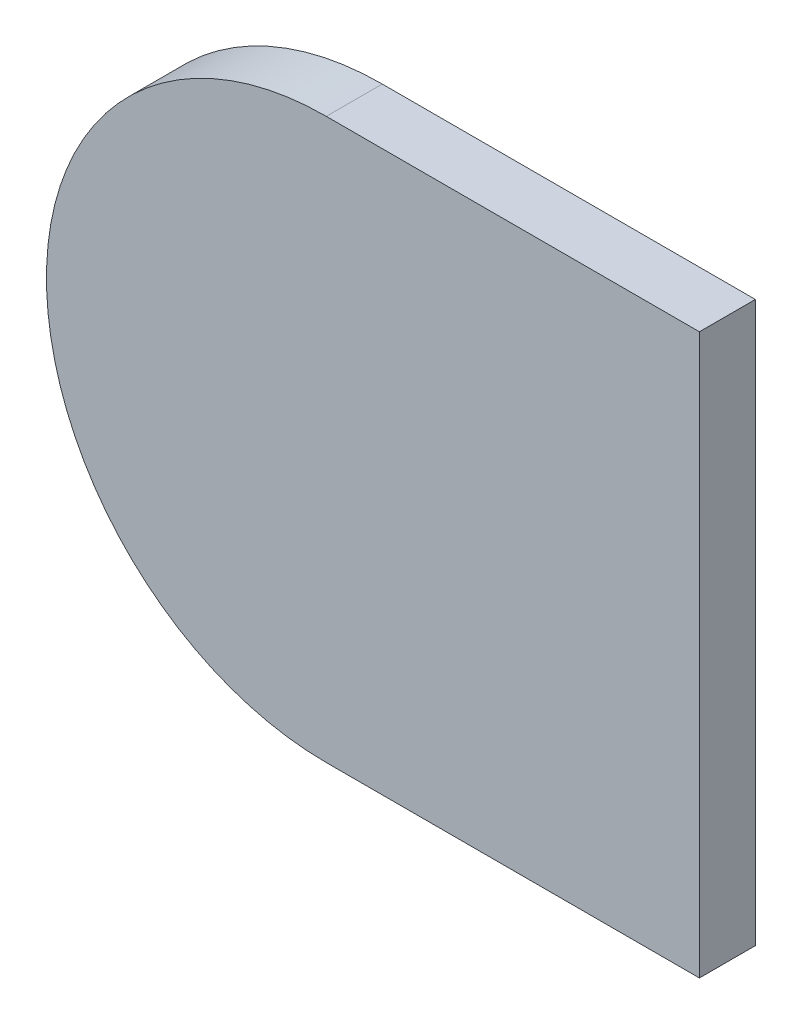
ISO-10303-21;
HEADER;
FILE_DESCRIPTION(('STEP AP214'),'2;1');
FILE_NAME('part.step','',(''),(''),'','','');
FILE_SCHEMA(('AUTOMOTIVE_DESIGN { 1 0 10303 214 1 1 1 1 }'));
ENDSEC;
DATA;
#1=APPLICATION_CONTEXT('core data for automotive mechanical design processes');
#2=APPLICATION_PROTOCOL_DEFINITION('international standard','automotive_design',2000,#1);
#3=PRODUCT_CONTEXT('',#1,'mechanical');
#4=PRODUCT('Part','Part','',(#3));
#5=PRODUCT_RELATED_PRODUCT_CATEGORY('part','',(#4));
#6=PRODUCT_DEFINITION_FORMATION('','',#4);
#7=PRODUCT_DEFINITION_CONTEXT('part definition',#1,'design');
#8=PRODUCT_DEFINITION('design','',#6,#7);
#9=PRODUCT_DEFINITION_SHAPE('','',#8);
#10=(LENGTH_UNIT() NAMED_UNIT(*) SI_UNIT(.MILLI.,.METRE.));
#11=(NAMED_UNIT(*) PLANE_ANGLE_UNIT() SI_UNIT($,.RADIAN.));
#12=(NAMED_UNIT(*) SI_UNIT($,.STERADIAN.) SOLID_ANGLE_UNIT());
#13=UNCERTAINTY_MEASURE_WITH_UNIT(LENGTH_MEASURE(1.E-05),#10,'distance_accuracy_value','');
#14=(GEOMETRIC_REPRESENTATION_CONTEXT(3) GLOBAL_UNCERTAINTY_ASSIGNED_CONTEXT((#13)) GLOBAL_UNIT_ASSIGNED_CONTEXT((#10,
#11,#12)) REPRESENTATION_CONTEXT('',''));
#15=CARTESIAN_POINT('',(0.,0.,0.));
#16=DIRECTION('',(0.,0.,1.));
#17=DIRECTION('',(1.,0.,0.));
#18=AXIS2_PLACEMENT_3D('',#15,#16,#17);
#19=CARTESIAN_POINT('',(40.,0.,6.));
#20=DIRECTION('',(1.,0.,0.));
#21=DIRECTION('',(0.,0.,-1.));
#22=AXIS2_PLACEMENT_3D('',#19,#20,#21);
#23=PLANE('',#22);
#24=DIRECTION('',(0.,-1.,0.));
#25=VECTOR('',#24,1.);
#26=CARTESIAN_POINT('',(40.,0.,0.));
#27=LINE('',#26,#25);
#28=CARTESIAN_POINT('',(40.,30.,0.));
#29=VERTEX_POINT('',#28);
#30=CARTESIAN_POINT('',(40.,-30.,0.));
#31=VERTEX_POINT('',#30);
#32=EDGE_CURVE('E107',#29,#31,#27,.T.);
#33=ORIENTED_EDGE('',*,*,#32,.F.);
#34=DIRECTION('',(0.,0.,-1.));
#35=VECTOR('',#34,1.);
#36=CARTESIAN_POINT('',(40.,30.,6.));
#37=LINE('',#36,#35);
#38=CARTESIAN_POINT('',(40.,30.,6.));
#39=VERTEX_POINT('',#38);
#40=EDGE_CURVE('E11',#39,#29,#37,.T.);
#41=ORIENTED_EDGE('',*,*,#40,.F.);
#42=DIRECTION('',(0.,-1.,0.));
#43=VECTOR('',#42,1.);
#44=CARTESIAN_POINT('',(40.,0.,6.));
#45=LINE('',#44,#43);
#46=CARTESIAN_POINT('',(40.,-30.,6.));
#47=VERTEX_POINT('',#46);
#48=EDGE_CURVE('E100',#39,#47,#45,.T.);
#49=ORIENTED_EDGE('',*,*,#48,.T.);
#50=DIRECTION('',(0.,0.,-1.));
#51=VECTOR('',#50,1.);
#52=CARTESIAN_POINT('',(40.,-30.,6.));
#53=LINE('',#52,#51);
#54=EDGE_CURVE('E81',#47,#31,#53,.T.);
#55=ORIENTED_EDGE('',*,*,#54,.T.);
#56=EDGE_LOOP('',(#33,#41,#49,#55));
#57=FACE_BOUND('',#56,.T.);
#58=ADVANCED_FACE('F43',(#57),#23,.T.);
#59=CARTESIAN_POINT('',(0.,30.,6.));
#60=DIRECTION('',(0.,1.,0.));
#61=DIRECTION('',(0.,0.,1.));
#62=AXIS2_PLACEMENT_3D('',#59,#60,#61);
#63=PLANE('',#62);
#64=DIRECTION('',(1.,0.,0.));
#65=VECTOR('',#64,1.);
#66=CARTESIAN_POINT('',(0.,30.,0.));
#67=LINE('',#66,#65);
#68=CARTESIAN_POINT('',(0.,30.,0.));
#69=VERTEX_POINT('',#68);
#70=EDGE_CURVE('E94',#69,#29,#67,.T.);
#71=ORIENTED_EDGE('',*,*,#70,.F.);
#72=DIRECTION('',(0.,0.,-1.));
#73=VECTOR('',#72,1.);
#74=CARTESIAN_POINT('',(0.,30.,6.));
#75=LINE('',#74,#73);
#76=CARTESIAN_POINT('',(0.,30.,6.));
#77=VERTEX_POINT('',#76);
#78=EDGE_CURVE('E51',#77,#69,#75,.T.);
#79=ORIENTED_EDGE('',*,*,#78,.F.);
#80=DIRECTION('',(1.,0.,0.));
#81=VECTOR('',#80,1.);
#82=CARTESIAN_POINT('',(0.,30.,6.));
#83=LINE('',#82,#81);
#84=EDGE_CURVE('E92',#77,#39,#83,.T.);
#85=ORIENTED_EDGE('',*,*,#84,.T.);
#86=ORIENTED_EDGE('',*,*,#40,.T.);
#87=EDGE_LOOP('',(#71,#79,#85,#86));
#88=FACE_BOUND('',#87,.T.);
#89=ADVANCED_FACE('F90',(#88),#63,.T.);
#90=CARTESIAN_POINT('',(0.,0.,6.));
#91=DIRECTION('',(0.,0.,-1.));
#92=DIRECTION('',(-1.,0.,0.));
#93=AXIS2_PLACEMENT_3D('',#90,#91,#92);
#94=CYLINDRICAL_SURFACE('',#93,30.);
#95=CARTESIAN_POINT('',(0.,0.,0.));
#96=DIRECTION('',(0.,0.,1.));
#97=DIRECTION('',(1.,0.,0.));
#98=AXIS2_PLACEMENT_3D('',#95,#96,#97);
#99=CIRCLE('',#98,30.);
#100=CARTESIAN_POINT('',(0.,-30.,0.));
#101=VERTEX_POINT('',#100);
#102=EDGE_CURVE('E74',#69,#101,#99,.T.);
#103=ORIENTED_EDGE('',*,*,#102,.T.);
#104=DIRECTION('',(0.,0.,-1.));
#105=VECTOR('',#104,1.);
#106=CARTESIAN_POINT('',(0.,-30.,6.));
#107=LINE('',#106,#105);
#108=CARTESIAN_POINT('',(0.,-30.,6.));
#109=VERTEX_POINT('',#108);
#110=EDGE_CURVE('E95',#109,#101,#107,.T.);
#111=ORIENTED_EDGE('',*,*,#110,.F.);
#112=CARTESIAN_POINT('',(0.,0.,6.));
#113=DIRECTION('',(0.,0.,1.));
#114=DIRECTION('',(1.,0.,0.));
#115=AXIS2_PLACEMENT_3D('',#112,#113,#114);
#116=CIRCLE('',#115,30.);
#117=EDGE_CURVE('E96',#77,#109,#116,.T.);
#118=ORIENTED_EDGE('',*,*,#117,.F.);
#119=ORIENTED_EDGE('',*,*,#78,.T.);
#120=EDGE_LOOP('',(#103,#111,#118,#119));
#121=FACE_BOUND('',#120,.T.);
#122=ADVANCED_FACE('F97',(#121),#94,.T.);
#123=CARTESIAN_POINT('',(0.,-30.,6.));
#124=DIRECTION('',(0.,1.,0.));
#125=DIRECTION('',(0.,0.,1.));
#126=AXIS2_PLACEMENT_3D('',#123,#124,#125);
#127=PLANE('',#126);
#128=DIRECTION('',(1.,0.,0.));
#129=VECTOR('',#128,1.);
#130=CARTESIAN_POINT('',(0.,-30.,0.));
#131=LINE('',#130,#129);
#132=EDGE_CURVE('E102',#101,#31,#131,.T.);
#133=ORIENTED_EDGE('',*,*,#132,.T.);
#134=ORIENTED_EDGE('',*,*,#54,.F.);
#135=DIRECTION('',(1.,0.,0.));
#136=VECTOR('',#135,1.);
#137=CARTESIAN_POINT('',(0.,-30.,6.));
#138=LINE('',#137,#136);
#139=EDGE_CURVE('E59',#109,#47,#138,.T.);
#140=ORIENTED_EDGE('',*,*,#139,.F.);
#141=ORIENTED_EDGE('',*,*,#110,.T.);
#142=EDGE_LOOP('',(#133,#134,#140,#141));
#143=FACE_BOUND('',#142,.T.);
#144=ADVANCED_FACE('F117',(#143),#127,.F.);
#145=CARTESIAN_POINT('',(0.,0.,6.));
#146=DIRECTION('',(0.,0.,1.));
#147=DIRECTION('',(1.,0.,0.));
#148=AXIS2_PLACEMENT_3D('',#145,#146,#147);
#149=PLANE('',#148);
#150=ORIENTED_EDGE('',*,*,#48,.F.);
#151=ORIENTED_EDGE('',*,*,#84,.F.);
#152=ORIENTED_EDGE('',*,*,#117,.T.);
#153=ORIENTED_EDGE('',*,*,#139,.T.);
#154=EDGE_LOOP('',(#150,#151,#152,#153));
#155=FACE_BOUND('',#154,.T.);
#156=ADVANCED_FACE('F99',(#155),#149,.T.);
#157=CARTESIAN_POINT('',(0.,0.,0.));
#158=DIRECTION('',(0.,0.,1.));
#159=DIRECTION('',(1.,0.,0.));
#160=AXIS2_PLACEMENT_3D('',#157,#158,#159);
#161=PLANE('',#160);
#162=CARTESIAN_POINT('',(0.,0.,0.));
#163=DIRECTION('',(0.,0.,-1.));
#164=DIRECTION('',(-1.,0.,0.));
#165=AXIS2_PLACEMENT_3D('',#162,#163,#164);
#166=CIRCLE('',#165,18.75);
#167=CARTESIAN_POINT('',(-18.75,0.,0.));
#168=VERTEX_POINT('',#167);
#169=EDGE_CURVE('E147',#168,#168,#166,.T.);
#170=ORIENTED_EDGE('',*,*,#169,.F.);
#171=EDGE_LOOP('',(#170));
#172=FACE_BOUND('',#171,.T.);
#173=ORIENTED_EDGE('',*,*,#32,.T.);
#174=ORIENTED_EDGE('',*,*,#132,.F.);
#175=ORIENTED_EDGE('',*,*,#102,.F.);
#176=ORIENTED_EDGE('',*,*,#70,.T.);
#177=EDGE_LOOP('',(#173,#174,#175,#176));
#178=FACE_BOUND('',#177,.T.);
#179=ADVANCED_FACE('F119',(#172,#178),#161,.F.);
#180=CARTESIAN_POINT('',(0.,0.,1.));
#181=DIRECTION('',(0.,0.,-1.));
#182=DIRECTION('',(-1.,0.,0.));
#183=AXIS2_PLACEMENT_3D('',#180,#181,#182);
#184=CYLINDRICAL_SURFACE('',#183,18.75);
#185=CARTESIAN_POINT('',(0.,0.,1.));
#186=DIRECTION('',(0.,0.,-1.));
#187=DIRECTION('',(-1.,0.,0.));
#188=AXIS2_PLACEMENT_3D('',#185,#186,#187);
#189=CIRCLE('',#188,18.75);
#190=CARTESIAN_POINT('',(-18.75,0.,1.));
#191=VERTEX_POINT('',#190);
#192=EDGE_CURVE('E110',#191,#191,#189,.T.);
#193=ORIENTED_EDGE('',*,*,#192,.F.);
#194=EDGE_LOOP('',(#193));
#195=FACE_BOUND('',#194,.T.);
#196=ORIENTED_EDGE('',*,*,#169,.T.);
#197=EDGE_LOOP('',(#196));
#198=FACE_BOUND('',#197,.T.);
#199=ADVANCED_FACE('F133',(#195,#198),#184,.F.);
#200=CARTESIAN_POINT('',(0.,0.,1.));
#201=DIRECTION('',(0.,0.,-1.));
#202=DIRECTION('',(-1.,0.,0.));
#203=AXIS2_PLACEMENT_3D('',#200,#201,#202);
#204=PLANE('',#203);
#205=ORIENTED_EDGE('',*,*,#192,.T.);
#206=EDGE_LOOP('',(#205));
#207=FACE_BOUND('',#206,.T.);
#208=ADVANCED_FACE('F139',(#207),#204,.T.);
#209=CLOSED_SHELL('',(#58,#89,#122,#144,#156,#179,#199,#208));
#210=MANIFOLD_SOLID_BREP('B2',#209);
#211=ADVANCED_BREP_SHAPE_REPRESENTATION('',(#18,#210),#14);
#212=SHAPE_DEFINITION_REPRESENTATION(#9,#211);
ENDSEC;
END-ISO-10303-21;
